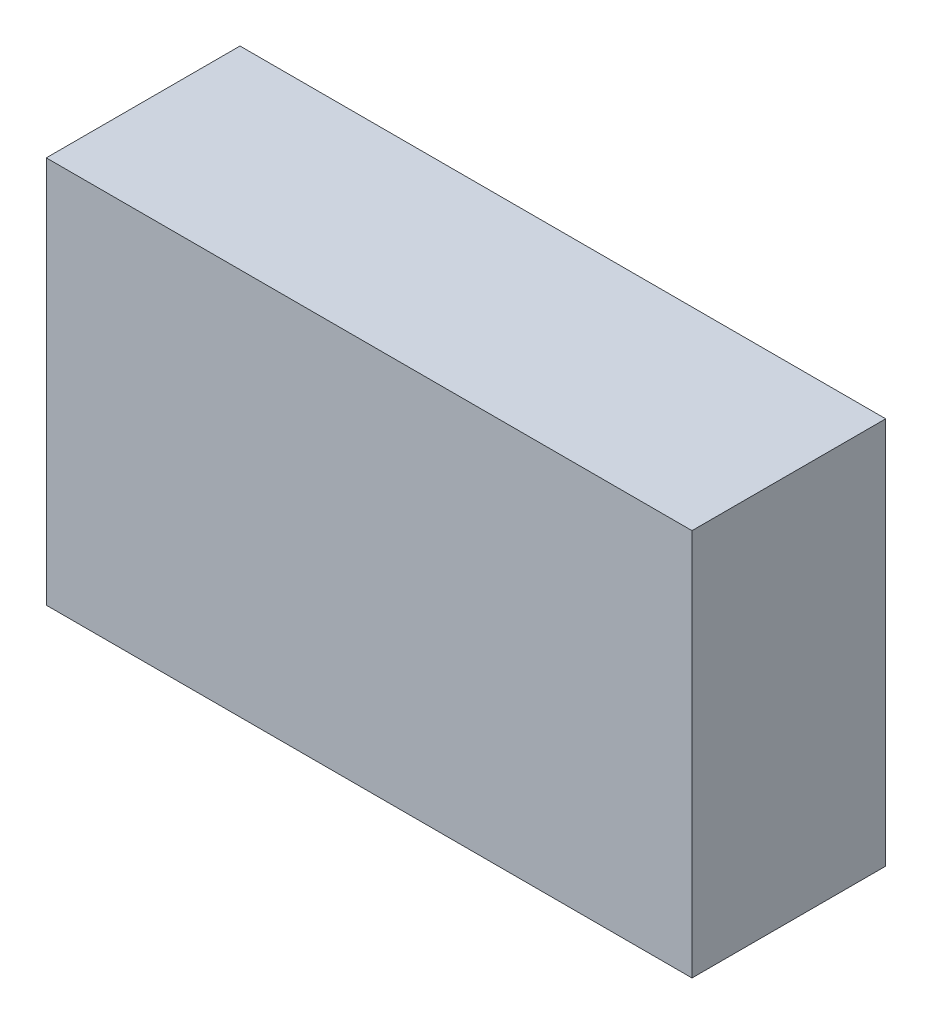
ISO-10303-21;
HEADER;
FILE_DESCRIPTION(('STEP AP214'),'2;1');
FILE_NAME('part.step','',(''),(''),'','','');
FILE_SCHEMA(('AUTOMOTIVE_DESIGN { 1 0 10303 214 1 1 1 1 }'));
ENDSEC;
DATA;
#1=APPLICATION_CONTEXT('core data for automotive mechanical design processes');
#2=APPLICATION_PROTOCOL_DEFINITION('international standard','automotive_design',2000,#1);
#3=PRODUCT_CONTEXT('',#1,'mechanical');
#4=PRODUCT('Part','Part','',(#3));
#5=PRODUCT_RELATED_PRODUCT_CATEGORY('part','',(#4));
#6=PRODUCT_DEFINITION_FORMATION('','',#4);
#7=PRODUCT_DEFINITION_CONTEXT('part definition',#1,'design');
#8=PRODUCT_DEFINITION('design','',#6,#7);
#9=PRODUCT_DEFINITION_SHAPE('','',#8);
#10=(LENGTH_UNIT() NAMED_UNIT(*) SI_UNIT(.MILLI.,.METRE.));
#11=(NAMED_UNIT(*) PLANE_ANGLE_UNIT() SI_UNIT($,.RADIAN.));
#12=(NAMED_UNIT(*) SI_UNIT($,.STERADIAN.) SOLID_ANGLE_UNIT());
#13=UNCERTAINTY_MEASURE_WITH_UNIT(LENGTH_MEASURE(1.E-05),#10,'distance_accuracy_value','');
#14=(GEOMETRIC_REPRESENTATION_CONTEXT(3) GLOBAL_UNCERTAINTY_ASSIGNED_CONTEXT((#13)) GLOBAL_UNIT_ASSIGNED_CONTEXT((#10,
#11,#12)) REPRESENTATION_CONTEXT('',''));
#15=CARTESIAN_POINT('',(0.,0.,0.));
#16=DIRECTION('',(0.,0.,1.));
#17=DIRECTION('',(1.,0.,0.));
#18=AXIS2_PLACEMENT_3D('',#15,#16,#17);
#19=CARTESIAN_POINT('',(142.55788314962,19.976778607054,0.294998645784));
#20=DIRECTION('',(4.371138828674E-08,-1.,0.));
#21=DIRECTION('',(0.,0.,-1.));
#22=AXIS2_PLACEMENT_3D('',#19,#20,#21);
#23=PLANE('',#22);
#24=CARTESIAN_POINT('',(142.55788314962,19.976778607054,0.29499864578364));
#25=DIRECTION('',(0.999999999999995,4.37113852058688E-08,-8.74227339825446E-08));
#26=VECTOR('',#25,1.);
#27=LINE('',#24,#26);
#28=CARTESIAN_POINT('',(142.55788314962,19.976778607054,0.29499864578388));
#29=VERTEX_POINT('',#28);
#30=CARTESIAN_POINT('',(143.55788314962,19.9767786507657,0.294998558361013));
#31=VERTEX_POINT('',#30);
#32=EDGE_CURVE('E83',#29,#31,#27,.T.);
#33=ORIENTED_EDGE('',*,*,#32,.F.);
#34=CARTESIAN_POINT('',(142.557883123393,19.976778607054,-0.00500135421597158));
#35=DIRECTION('',(8.74227542209936E-08,0.,0.999999999999996));
#36=VECTOR('',#35,1.);
#37=LINE('',#34,#36);
#38=CARTESIAN_POINT('',(142.557883123392,19.976778607054,-0.00500135421596988));
#39=VERTEX_POINT('',#38);
#40=EDGE_CURVE('E65',#39,#29,#37,.T.);
#41=ORIENTED_EDGE('',*,*,#40,.F.);
#42=CARTESIAN_POINT('',(142.55788312339,19.976778607054,-0.00500135421597001));
#43=DIRECTION('',(0.999999999999995,4.37113886753157E-08,-8.74227340367547E-08));
#44=VECTOR('',#43,1.);
#45=LINE('',#42,#44);
#46=CARTESIAN_POINT('',(143.557883123392,19.9767786507657,-0.00500144163870385));
#47=VERTEX_POINT('',#46);
#48=EDGE_CURVE('E58',#39,#47,#45,.T.);
#49=ORIENTED_EDGE('',*,*,#48,.T.);
#50=CARTESIAN_POINT('',(143.55788314962,19.976778650766,0.294998558361));
#51=DIRECTION('',(-8.74227542210713E-08,0.,-0.999999999999996));
#52=VECTOR('',#51,1.);
#53=LINE('',#50,#52);
#54=EDGE_CURVE('E63',#31,#47,#53,.T.);
#55=ORIENTED_EDGE('',*,*,#54,.F.);
#56=EDGE_LOOP('',(#33,#41,#49,#55));
#57=FACE_BOUND('',#56,.T.);
#58=ADVANCED_FACE('F16',(#57),#23,.T.);
#59=CARTESIAN_POINT('',(143.15788325234,17.026778633281,-0.00500140666961));
#60=DIRECTION('',(8.74227339409097E-08,0.,1.));
#61=DIRECTION('',(4.37113882867345E-08,-1.,0.));
#62=AXIS2_PLACEMENT_3D('',#59,#60,#61);
#63=PLANE('',#62);
#64=CARTESIAN_POINT('',(143.557883123393,19.976778650766,-0.00500144163870502));
#65=DIRECTION('',(-4.3711377110493E-08,0.999999999999999,0.));
#66=VECTOR('',#65,1.);
#67=LINE('',#64,#66);
#68=CARTESIAN_POINT('',(143.557883097163,20.5767786507657,-0.00500144163870386));
#69=VERTEX_POINT('',#68);
#70=EDGE_CURVE('E74',#47,#69,#67,.T.);
#71=ORIENTED_EDGE('',*,*,#70,.F.);
#72=ORIENTED_EDGE('',*,*,#48,.F.);
#73=CARTESIAN_POINT('',(142.557883097166,20.576778607054,-0.00500135421597158));
#74=DIRECTION('',(4.37113771104928E-08,-0.999999999999999,0.));
#75=VECTOR('',#74,1.);
#76=LINE('',#73,#75);
#77=CARTESIAN_POINT('',(142.557883097163,20.576778607054,-0.00500135421596988));
#78=VERTEX_POINT('',#77);
#79=EDGE_CURVE('E70',#78,#39,#76,.T.);
#80=ORIENTED_EDGE('',*,*,#79,.F.);
#81=CARTESIAN_POINT('',(143.55788309716,20.5767786507654,-0.00500144163870404));
#82=DIRECTION('',(-0.999999999999995,-4.37113886753157E-08,8.74227340367547E-08));
#83=VECTOR('',#82,1.);
#84=LINE('',#81,#83);
#85=EDGE_CURVE('E78',#69,#78,#84,.T.);
#86=ORIENTED_EDGE('',*,*,#85,.F.);
#87=EDGE_LOOP('',(#71,#72,#80,#86));
#88=FACE_BOUND('',#87,.T.);
#89=ADVANCED_FACE('F76',(#88),#63,.F.);
#90=CARTESIAN_POINT('',(142.55788314962,19.976778607054,0.294998645784));
#91=DIRECTION('',(-1.,-4.37113882867398E-08,8.74227339409096E-08));
#92=DIRECTION('',(-4.371138828674E-08,1.,0.));
#93=AXIS2_PLACEMENT_3D('',#90,#91,#92);
#94=PLANE('',#93);
#95=CARTESIAN_POINT('',(142.557883123393,20.576778607054,0.29499864578364));
#96=DIRECTION('',(4.37113771104933E-08,-0.999999999999999,0.));
#97=VECTOR('',#96,1.);
#98=LINE('',#95,#97);
#99=CARTESIAN_POINT('',(142.557883123392,20.576778607054,0.29499864578388));
#100=VERTEX_POINT('',#99);
#101=EDGE_CURVE('E253',#100,#29,#98,.T.);
#102=ORIENTED_EDGE('',*,*,#101,.F.);
#103=CARTESIAN_POINT('',(142.557883097163,20.576778607054,-0.00500135421597001));
#104=DIRECTION('',(8.7422754220994E-08,0.,0.999999999999996));
#105=VECTOR('',#104,1.);
#106=LINE('',#103,#105);
#107=EDGE_CURVE('E134',#78,#100,#106,.T.);
#108=ORIENTED_EDGE('',*,*,#107,.F.);
#109=ORIENTED_EDGE('',*,*,#79,.T.);
#110=ORIENTED_EDGE('',*,*,#40,.T.);
#111=EDGE_LOOP('',(#102,#108,#109,#110));
#112=FACE_BOUND('',#111,.T.);
#113=ADVANCED_FACE('F279',(#112),#94,.T.);
#114=CARTESIAN_POINT('',(143.15788327857,17.026778633281,0.29499859333));
#115=DIRECTION('',(8.74227339409097E-08,0.,1.));
#116=DIRECTION('',(4.37113882867345E-08,-1.,0.));
#117=AXIS2_PLACEMENT_3D('',#114,#115,#116);
#118=PLANE('',#117);
#119=ORIENTED_EDGE('',*,*,#32,.T.);
#120=CARTESIAN_POINT('',(143.557883123393,20.576778650766,0.294998558360998));
#121=DIRECTION('',(4.3711377110493E-08,-0.999999999999999,0.));
#122=VECTOR('',#121,1.);
#123=LINE('',#120,#122);
#124=CARTESIAN_POINT('',(143.557883123392,20.5767786507657,0.294998558361013));
#125=VERTEX_POINT('',#124);
#126=EDGE_CURVE('E36',#125,#31,#123,.T.);
#127=ORIENTED_EDGE('',*,*,#126,.F.);
#128=CARTESIAN_POINT('',(142.55788312339,20.576778607054,0.294998645784));
#129=DIRECTION('',(0.999999999999995,4.37113886753157E-08,-8.74227339283345E-08));
#130=VECTOR('',#129,1.);
#131=LINE('',#128,#130);
#132=EDGE_CURVE('E28',#100,#125,#131,.T.);
#133=ORIENTED_EDGE('',*,*,#132,.F.);
#134=ORIENTED_EDGE('',*,*,#101,.T.);
#135=EDGE_LOOP('',(#119,#127,#133,#134));
#136=FACE_BOUND('',#135,.T.);
#137=ADVANCED_FACE('F109',(#136),#118,.T.);
#138=CARTESIAN_POINT('',(143.55788314962,19.976778650766,0.294998558361));
#139=DIRECTION('',(1.,4.37113882867398E-08,-8.74227339409096E-08));
#140=DIRECTION('',(0.,-0.894427103764636,-0.447213769970476));
#141=AXIS2_PLACEMENT_3D('',#138,#139,#140);
#142=PLANE('',#141);
#143=ORIENTED_EDGE('',*,*,#126,.T.);
#144=ORIENTED_EDGE('',*,*,#54,.T.);
#145=ORIENTED_EDGE('',*,*,#70,.T.);
#146=CARTESIAN_POINT('',(143.55788312339,20.5767786507654,0.294998558361));
#147=DIRECTION('',(-8.74227542210715E-08,0.,-0.999999999999996));
#148=VECTOR('',#147,1.);
#149=LINE('',#146,#148);
#150=EDGE_CURVE('E11',#125,#69,#149,.T.);
#151=ORIENTED_EDGE('',*,*,#150,.F.);
#152=EDGE_LOOP('',(#143,#144,#145,#151));
#153=FACE_BOUND('',#152,.T.);
#154=ADVANCED_FACE('F87',(#153),#142,.T.);
#155=CARTESIAN_POINT('',(142.55788312339,20.576778607054,0.294998645784));
#156=DIRECTION('',(-4.371138828674E-08,1.,0.));
#157=DIRECTION('',(0.,0.,1.));
#158=AXIS2_PLACEMENT_3D('',#155,#156,#157);
#159=PLANE('',#158);
#160=ORIENTED_EDGE('',*,*,#132,.T.);
#161=ORIENTED_EDGE('',*,*,#150,.T.);
#162=ORIENTED_EDGE('',*,*,#85,.T.);
#163=ORIENTED_EDGE('',*,*,#107,.T.);
#164=EDGE_LOOP('',(#160,#161,#162,#163));
#165=FACE_BOUND('',#164,.T.);
#166=ADVANCED_FACE('F108',(#165),#159,.T.);
#167=CLOSED_SHELL('',(#58,#89,#113,#137,#154,#166));
#168=MANIFOLD_SOLID_BREP('B1',#167);
#169=ADVANCED_BREP_SHAPE_REPRESENTATION('',(#18,#168),#14);
#170=SHAPE_DEFINITION_REPRESENTATION(#9,#169);
ENDSEC;
END-ISO-10303-21;
